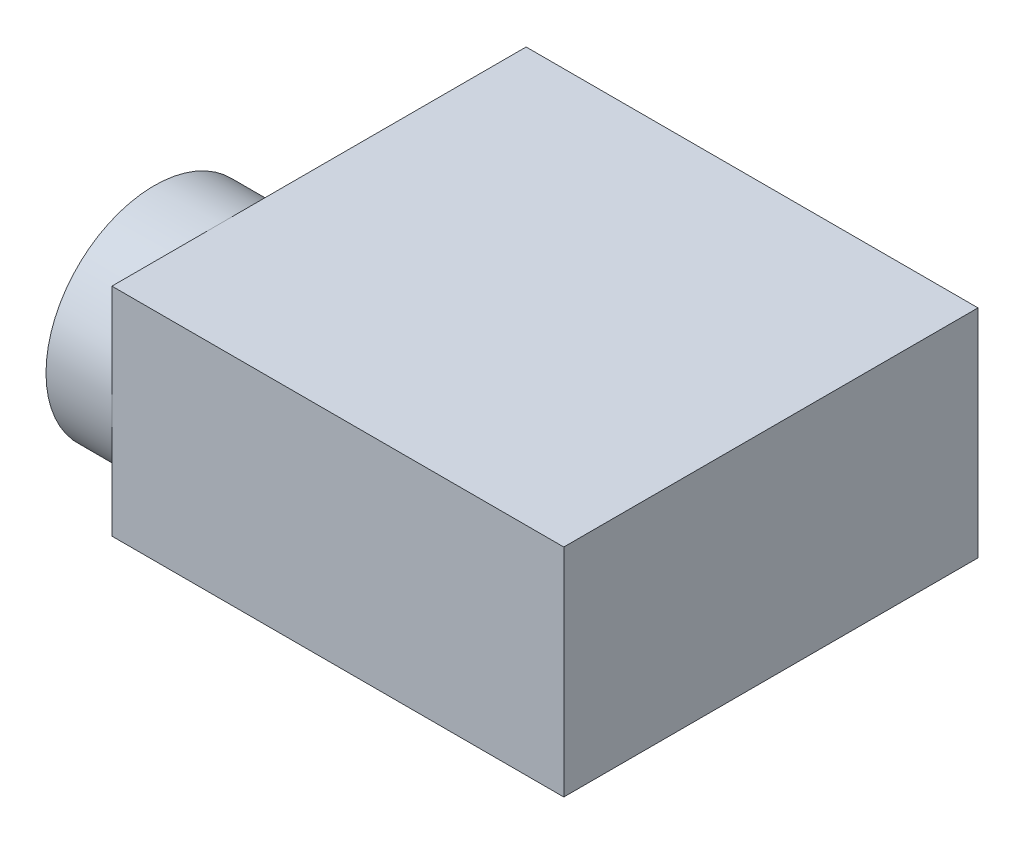
ISO-10303-21;
HEADER;
FILE_DESCRIPTION(('STEP AP214'),'2;1');
FILE_NAME('part.step','',(''),(''),'','','');
FILE_SCHEMA(('AUTOMOTIVE_DESIGN { 1 0 10303 214 1 1 1 1 }'));
ENDSEC;
DATA;
#1=APPLICATION_CONTEXT('core data for automotive mechanical design processes');
#2=APPLICATION_PROTOCOL_DEFINITION('international standard','automotive_design',2000,#1);
#3=PRODUCT_CONTEXT('',#1,'mechanical');
#4=PRODUCT('Part','Part','',(#3));
#5=PRODUCT_RELATED_PRODUCT_CATEGORY('part','',(#4));
#6=PRODUCT_DEFINITION_FORMATION('','',#4);
#7=PRODUCT_DEFINITION_CONTEXT('part definition',#1,'design');
#8=PRODUCT_DEFINITION('design','',#6,#7);
#9=PRODUCT_DEFINITION_SHAPE('','',#8);
#10=(LENGTH_UNIT() NAMED_UNIT(*) SI_UNIT(.MILLI.,.METRE.));
#11=(NAMED_UNIT(*) PLANE_ANGLE_UNIT() SI_UNIT($,.RADIAN.));
#12=(NAMED_UNIT(*) SI_UNIT($,.STERADIAN.) SOLID_ANGLE_UNIT());
#13=UNCERTAINTY_MEASURE_WITH_UNIT(LENGTH_MEASURE(1.E-05),#10,'distance_accuracy_value','');
#14=(GEOMETRIC_REPRESENTATION_CONTEXT(3) GLOBAL_UNCERTAINTY_ASSIGNED_CONTEXT((#13)) GLOBAL_UNIT_ASSIGNED_CONTEXT((#10,
#11,#12)) REPRESENTATION_CONTEXT('',''));
#15=CARTESIAN_POINT('',(0.,0.,0.));
#16=DIRECTION('',(0.,0.,1.));
#17=DIRECTION('',(1.,0.,0.));
#18=AXIS2_PLACEMENT_3D('',#15,#16,#17);
#19=CARTESIAN_POINT('',(-24.,11.5,0.));
#20=DIRECTION('',(1.,0.,0.));
#21=DIRECTION('',(0.,0.,-1.));
#22=AXIS2_PLACEMENT_3D('',#19,#20,#21);
#23=PLANE('',#22);
#24=CARTESIAN_POINT('',(-24.,5.75,-11.140964663212));
#25=DIRECTION('',(-1.,0.,0.));
#26=DIRECTION('',(0.,0.,1.));
#27=AXIS2_PLACEMENT_3D('',#24,#25,#26);
#28=CIRCLE('',#27,2.);
#29=CARTESIAN_POINT('',(-24.,7.75,-11.140964663212));
#30=VERTEX_POINT('',#29);
#31=CARTESIAN_POINT('',(-24.,3.75,-11.140964663212));
#32=VERTEX_POINT('',#31);
#33=EDGE_CURVE('E117',#30,#32,#28,.T.);
#34=ORIENTED_EDGE('',*,*,#33,.F.);
#35=CARTESIAN_POINT('',(-24.,5.75,-5.75));
#36=DIRECTION('',(-1.,0.,0.));
#37=DIRECTION('',(0.,0.,1.));
#38=AXIS2_PLACEMENT_3D('',#35,#36,#37);
#39=CIRCLE('',#38,5.75);
#40=CARTESIAN_POINT('',(-24.,11.5,-5.75));
#41=VERTEX_POINT('',#40);
#42=EDGE_CURVE('E60',#41,#30,#39,.T.);
#43=ORIENTED_EDGE('',*,*,#42,.F.);
#44=DIRECTION('',(0.,0.,1.));
#45=VECTOR('',#44,1.);
#46=CARTESIAN_POINT('',(-24.,11.5,0.));
#47=LINE('',#46,#45);
#48=CARTESIAN_POINT('',(-24.,11.5,-22.));
#49=VERTEX_POINT('',#48);
#50=EDGE_CURVE('E132',#49,#41,#47,.T.);
#51=ORIENTED_EDGE('',*,*,#50,.F.);
#52=DIRECTION('',(0.,-1.,0.));
#53=VECTOR('',#52,1.);
#54=CARTESIAN_POINT('',(-24.,11.5,-22.));
#55=LINE('',#54,#53);
#56=CARTESIAN_POINT('',(-24.,0.,-22.));
#57=VERTEX_POINT('',#56);
#58=EDGE_CURVE('E148',#49,#57,#55,.T.);
#59=ORIENTED_EDGE('',*,*,#58,.T.);
#60=DIRECTION('',(0.,0.,1.));
#61=VECTOR('',#60,1.);
#62=CARTESIAN_POINT('',(-24.,0.,0.));
#63=LINE('',#62,#61);
#64=CARTESIAN_POINT('',(-24.,0.,-5.75));
#65=VERTEX_POINT('',#64);
#66=EDGE_CURVE('E140',#57,#65,#63,.T.);
#67=ORIENTED_EDGE('',*,*,#66,.T.);
#68=EDGE_CURVE('E48',#32,#65,#39,.T.);
#69=ORIENTED_EDGE('',*,*,#68,.F.);
#70=EDGE_LOOP('',(#34,#43,#51,#59,#67,#69));
#71=FACE_BOUND('',#70,.T.);
#72=ADVANCED_FACE('F37',(#71),#23,.F.);
#73=CARTESIAN_POINT('',(-24.,5.75,0.));
#74=VERTEX_POINT('',#73);
#75=EDGE_CURVE('E11',#65,#74,#39,.T.);
#76=ORIENTED_EDGE('',*,*,#75,.F.);
#77=CARTESIAN_POINT('',(-24.,0.,0.));
#78=VERTEX_POINT('',#77);
#79=EDGE_CURVE('E139',#65,#78,#63,.T.);
#80=ORIENTED_EDGE('',*,*,#79,.T.);
#81=DIRECTION('',(0.,-1.,0.));
#82=VECTOR('',#81,1.);
#83=CARTESIAN_POINT('',(-24.,11.5,0.));
#84=LINE('',#83,#82);
#85=EDGE_CURVE('E145',#74,#78,#84,.T.);
#86=ORIENTED_EDGE('',*,*,#85,.F.);
#87=EDGE_LOOP('',(#76,#80,#86));
#88=FACE_BOUND('',#87,.T.);
#89=ADVANCED_FACE('F178',(#88),#23,.F.);
#90=CARTESIAN_POINT('',(0.,11.5,0.));
#91=DIRECTION('',(-1.,0.,0.));
#92=DIRECTION('',(0.,0.,1.));
#93=AXIS2_PLACEMENT_3D('',#90,#91,#92);
#94=PLANE('',#93);
#95=DIRECTION('',(0.,0.,-1.));
#96=VECTOR('',#95,1.);
#97=CARTESIAN_POINT('',(0.,0.,0.));
#98=LINE('',#97,#96);
#99=CARTESIAN_POINT('',(0.,0.,0.));
#100=VERTEX_POINT('',#99);
#101=CARTESIAN_POINT('',(0.,0.,-22.));
#102=VERTEX_POINT('',#101);
#103=EDGE_CURVE('E118',#100,#102,#98,.T.);
#104=ORIENTED_EDGE('',*,*,#103,.T.);
#105=DIRECTION('',(0.,-1.,0.));
#106=VECTOR('',#105,1.);
#107=CARTESIAN_POINT('',(0.,11.5,-22.));
#108=LINE('',#107,#106);
#109=CARTESIAN_POINT('',(0.,11.5,-22.));
#110=VERTEX_POINT('',#109);
#111=EDGE_CURVE('E41',#110,#102,#108,.T.);
#112=ORIENTED_EDGE('',*,*,#111,.F.);
#113=DIRECTION('',(0.,0.,-1.));
#114=VECTOR('',#113,1.);
#115=CARTESIAN_POINT('',(0.,11.5,0.));
#116=LINE('',#115,#114);
#117=CARTESIAN_POINT('',(0.,11.5,0.));
#118=VERTEX_POINT('',#117);
#119=EDGE_CURVE('E125',#118,#110,#116,.T.);
#120=ORIENTED_EDGE('',*,*,#119,.F.);
#121=DIRECTION('',(0.,-1.,0.));
#122=VECTOR('',#121,1.);
#123=CARTESIAN_POINT('',(0.,11.5,0.));
#124=LINE('',#123,#122);
#125=EDGE_CURVE('E136',#118,#100,#124,.T.);
#126=ORIENTED_EDGE('',*,*,#125,.T.);
#127=EDGE_LOOP('',(#104,#112,#120,#126));
#128=FACE_BOUND('',#127,.T.);
#129=ADVANCED_FACE('F39',(#128),#94,.F.);
#130=CARTESIAN_POINT('',(-20.,11.5,-22.));
#131=DIRECTION('',(0.,0.,1.));
#132=DIRECTION('',(1.,0.,0.));
#133=AXIS2_PLACEMENT_3D('',#130,#131,#132);
#134=PLANE('',#133);
#135=DIRECTION('',(-1.,0.,0.));
#136=VECTOR('',#135,1.);
#137=CARTESIAN_POINT('',(-20.,0.,-22.));
#138=LINE('',#137,#136);
#139=EDGE_CURVE('E121',#102,#57,#138,.T.);
#140=ORIENTED_EDGE('',*,*,#139,.T.);
#141=ORIENTED_EDGE('',*,*,#58,.F.);
#142=DIRECTION('',(-1.,0.,0.));
#143=VECTOR('',#142,1.);
#144=CARTESIAN_POINT('',(0.,11.5,-22.));
#145=LINE('',#144,#143);
#146=EDGE_CURVE('E128',#110,#49,#145,.T.);
#147=ORIENTED_EDGE('',*,*,#146,.F.);
#148=ORIENTED_EDGE('',*,*,#111,.T.);
#149=EDGE_LOOP('',(#140,#141,#147,#148));
#150=FACE_BOUND('',#149,.T.);
#151=ADVANCED_FACE('F188',(#150),#134,.F.);
#152=EDGE_CURVE('E46',#74,#41,#39,.T.);
#153=ORIENTED_EDGE('',*,*,#152,.F.);
#154=CARTESIAN_POINT('',(-24.,11.5,0.));
#155=VERTEX_POINT('',#154);
#156=EDGE_CURVE('E146',#155,#74,#84,.T.);
#157=ORIENTED_EDGE('',*,*,#156,.F.);
#158=EDGE_CURVE('E131',#41,#155,#47,.T.);
#159=ORIENTED_EDGE('',*,*,#158,.F.);
#160=EDGE_LOOP('',(#153,#157,#159));
#161=FACE_BOUND('',#160,.T.);
#162=ADVANCED_FACE('F180',(#161),#23,.F.);
#163=CARTESIAN_POINT('',(0.,11.5,0.));
#164=DIRECTION('',(0.,0.,-1.));
#165=DIRECTION('',(-1.,0.,0.));
#166=AXIS2_PLACEMENT_3D('',#163,#164,#165);
#167=PLANE('',#166);
#168=DIRECTION('',(1.,0.,0.));
#169=VECTOR('',#168,1.);
#170=CARTESIAN_POINT('',(0.,0.,0.));
#171=LINE('',#170,#169);
#172=EDGE_CURVE('E129',#78,#100,#171,.T.);
#173=ORIENTED_EDGE('',*,*,#172,.T.);
#174=ORIENTED_EDGE('',*,*,#125,.F.);
#175=DIRECTION('',(1.,0.,0.));
#176=VECTOR('',#175,1.);
#177=CARTESIAN_POINT('',(-20.,11.5,0.));
#178=LINE('',#177,#176);
#179=EDGE_CURVE('E135',#155,#118,#178,.T.);
#180=ORIENTED_EDGE('',*,*,#179,.F.);
#181=ORIENTED_EDGE('',*,*,#156,.T.);
#182=ORIENTED_EDGE('',*,*,#85,.T.);
#183=EDGE_LOOP('',(#173,#174,#180,#181,#182));
#184=FACE_BOUND('',#183,.T.);
#185=ADVANCED_FACE('F187',(#184),#167,.F.);
#186=CARTESIAN_POINT('',(0.,11.5,0.));
#187=DIRECTION('',(0.,1.,0.));
#188=DIRECTION('',(0.,0.,1.));
#189=AXIS2_PLACEMENT_3D('',#186,#187,#188);
#190=PLANE('',#189);
#191=ORIENTED_EDGE('',*,*,#179,.T.);
#192=ORIENTED_EDGE('',*,*,#119,.T.);
#193=ORIENTED_EDGE('',*,*,#146,.T.);
#194=ORIENTED_EDGE('',*,*,#50,.T.);
#195=ORIENTED_EDGE('',*,*,#158,.T.);
#196=EDGE_LOOP('',(#191,#192,#193,#194,#195));
#197=FACE_BOUND('',#196,.T.);
#198=ADVANCED_FACE('F195',(#197),#190,.T.);
#199=CARTESIAN_POINT('',(0.,0.,0.));
#200=DIRECTION('',(0.,1.,0.));
#201=DIRECTION('',(0.,0.,1.));
#202=AXIS2_PLACEMENT_3D('',#199,#200,#201);
#203=PLANE('',#202);
#204=ORIENTED_EDGE('',*,*,#172,.F.);
#205=ORIENTED_EDGE('',*,*,#79,.F.);
#206=ORIENTED_EDGE('',*,*,#66,.F.);
#207=ORIENTED_EDGE('',*,*,#139,.F.);
#208=ORIENTED_EDGE('',*,*,#103,.F.);
#209=EDGE_LOOP('',(#204,#205,#206,#207,#208));
#210=FACE_BOUND('',#209,.T.);
#211=ADVANCED_FACE('F209',(#210),#203,.F.);
#212=CARTESIAN_POINT('',(-27.5,5.75,-11.140964663212));
#213=DIRECTION('',(1.,0.,0.));
#214=DIRECTION('',(0.,0.,-1.));
#215=AXIS2_PLACEMENT_3D('',#212,#213,#214);
#216=CYLINDRICAL_SURFACE('',#215,2.);
#217=ORIENTED_EDGE('',*,*,#33,.T.);
#218=DIRECTION('',(1.,0.,0.));
#219=VECTOR('',#218,1.);
#220=CARTESIAN_POINT('',(-27.5,3.75,-11.140964663212));
#221=LINE('',#220,#219);
#222=CARTESIAN_POINT('',(-27.5,3.75,-11.140964663212));
#223=VERTEX_POINT('',#222);
#224=EDGE_CURVE('E105',#223,#32,#221,.T.);
#225=ORIENTED_EDGE('',*,*,#224,.F.);
#226=CARTESIAN_POINT('',(-27.5,5.75,-11.140964663212));
#227=DIRECTION('',(-1.,0.,0.));
#228=DIRECTION('',(0.,0.,1.));
#229=AXIS2_PLACEMENT_3D('',#226,#227,#228);
#230=CIRCLE('',#229,2.);
#231=CARTESIAN_POINT('',(-27.5,7.75,-11.140964663212));
#232=VERTEX_POINT('',#231);
#233=EDGE_CURVE('E111',#232,#223,#230,.T.);
#234=ORIENTED_EDGE('',*,*,#233,.F.);
#235=DIRECTION('',(1.,0.,0.));
#236=VECTOR('',#235,1.);
#237=CARTESIAN_POINT('',(-27.5,7.75,-11.140964663212));
#238=LINE('',#237,#236);
#239=EDGE_CURVE('E108',#232,#30,#238,.T.);
#240=ORIENTED_EDGE('',*,*,#239,.T.);
#241=EDGE_LOOP('',(#217,#225,#234,#240));
#242=FACE_BOUND('',#241,.T.);
#243=ADVANCED_FACE('F116',(#242),#216,.T.);
#244=CARTESIAN_POINT('',(-27.5,5.75,-5.75));
#245=DIRECTION('',(1.,0.,0.));
#246=DIRECTION('',(0.,0.,-1.));
#247=AXIS2_PLACEMENT_3D('',#244,#245,#246);
#248=CYLINDRICAL_SURFACE('',#247,5.75);
#249=ORIENTED_EDGE('',*,*,#239,.F.);
#250=CARTESIAN_POINT('',(-27.5,5.75,-5.75));
#251=DIRECTION('',(-1.,0.,0.));
#252=DIRECTION('',(0.,0.,1.));
#253=AXIS2_PLACEMENT_3D('',#250,#251,#252);
#254=CIRCLE('',#253,5.75);
#255=EDGE_CURVE('E101',#223,#232,#254,.T.);
#256=ORIENTED_EDGE('',*,*,#255,.F.);
#257=ORIENTED_EDGE('',*,*,#224,.T.);
#258=ORIENTED_EDGE('',*,*,#68,.T.);
#259=ORIENTED_EDGE('',*,*,#75,.T.);
#260=ORIENTED_EDGE('',*,*,#152,.T.);
#261=ORIENTED_EDGE('',*,*,#42,.T.);
#262=EDGE_LOOP('',(#249,#256,#257,#258,#259,#260,#261));
#263=FACE_BOUND('',#262,.T.);
#264=ADVANCED_FACE('F103',(#263),#248,.T.);
#265=CARTESIAN_POINT('',(-27.5,5.75,-8.44548233160598));
#266=DIRECTION('',(-1.,0.,0.));
#267=DIRECTION('',(0.,0.,1.));
#268=AXIS2_PLACEMENT_3D('',#265,#266,#267);
#269=PLANE('',#268);
#270=CARTESIAN_POINT('',(-27.5,5.75,-5.75));
#271=DIRECTION('',(-1.,0.,0.));
#272=DIRECTION('',(0.,0.,1.));
#273=AXIS2_PLACEMENT_3D('',#270,#271,#272);
#274=CIRCLE('',#273,1.5);
#275=CARTESIAN_POINT('',(-27.5,5.75,-4.25));
#276=VERTEX_POINT('',#275);
#277=EDGE_CURVE('E159',#276,#276,#274,.T.);
#278=ORIENTED_EDGE('',*,*,#277,.F.);
#279=EDGE_LOOP('',(#278));
#280=FACE_BOUND('',#279,.T.);
#281=ORIENTED_EDGE('',*,*,#233,.T.);
#282=ORIENTED_EDGE('',*,*,#255,.T.);
#283=EDGE_LOOP('',(#281,#282));
#284=FACE_BOUND('',#283,.T.);
#285=ADVANCED_FACE('F113',(#280,#284),#269,.T.);
#286=CARTESIAN_POINT('',(-30.5,5.75,-5.75));
#287=DIRECTION('',(1.,0.,0.));
#288=DIRECTION('',(0.,0.,-1.));
#289=AXIS2_PLACEMENT_3D('',#286,#287,#288);
#290=CYLINDRICAL_SURFACE('',#289,1.5);
#291=CARTESIAN_POINT('',(-30.5,5.75,-5.75));
#292=DIRECTION('',(-1.,0.,0.));
#293=DIRECTION('',(0.,0.,1.));
#294=AXIS2_PLACEMENT_3D('',#291,#292,#293);
#295=CIRCLE('',#294,1.5);
#296=CARTESIAN_POINT('',(-30.5,5.75,-4.25));
#297=VERTEX_POINT('',#296);
#298=EDGE_CURVE('E157',#297,#297,#295,.T.);
#299=ORIENTED_EDGE('',*,*,#298,.F.);
#300=EDGE_LOOP('',(#299));
#301=FACE_BOUND('',#300,.T.);
#302=ORIENTED_EDGE('',*,*,#277,.T.);
#303=EDGE_LOOP('',(#302));
#304=FACE_BOUND('',#303,.T.);
#305=ADVANCED_FACE('F165',(#301,#304),#290,.T.);
#306=CARTESIAN_POINT('',(-30.5,5.75,-5.75));
#307=DIRECTION('',(-1.,0.,0.));
#308=DIRECTION('',(0.,0.,1.));
#309=AXIS2_PLACEMENT_3D('',#306,#307,#308);
#310=PLANE('',#309);
#311=ORIENTED_EDGE('',*,*,#298,.T.);
#312=EDGE_LOOP('',(#311));
#313=FACE_BOUND('',#312,.T.);
#314=ADVANCED_FACE('F173',(#313),#310,.T.);
#315=CLOSED_SHELL('',(#72,#89,#129,#151,#162,#185,#198,#211,#243,#264,#285,#305,#314));
#316=MANIFOLD_SOLID_BREP('B2',#315);
#317=ADVANCED_BREP_SHAPE_REPRESENTATION('',(#18,#316),#14);
#318=SHAPE_DEFINITION_REPRESENTATION(#9,#317);
ENDSEC;
END-ISO-10303-21;
